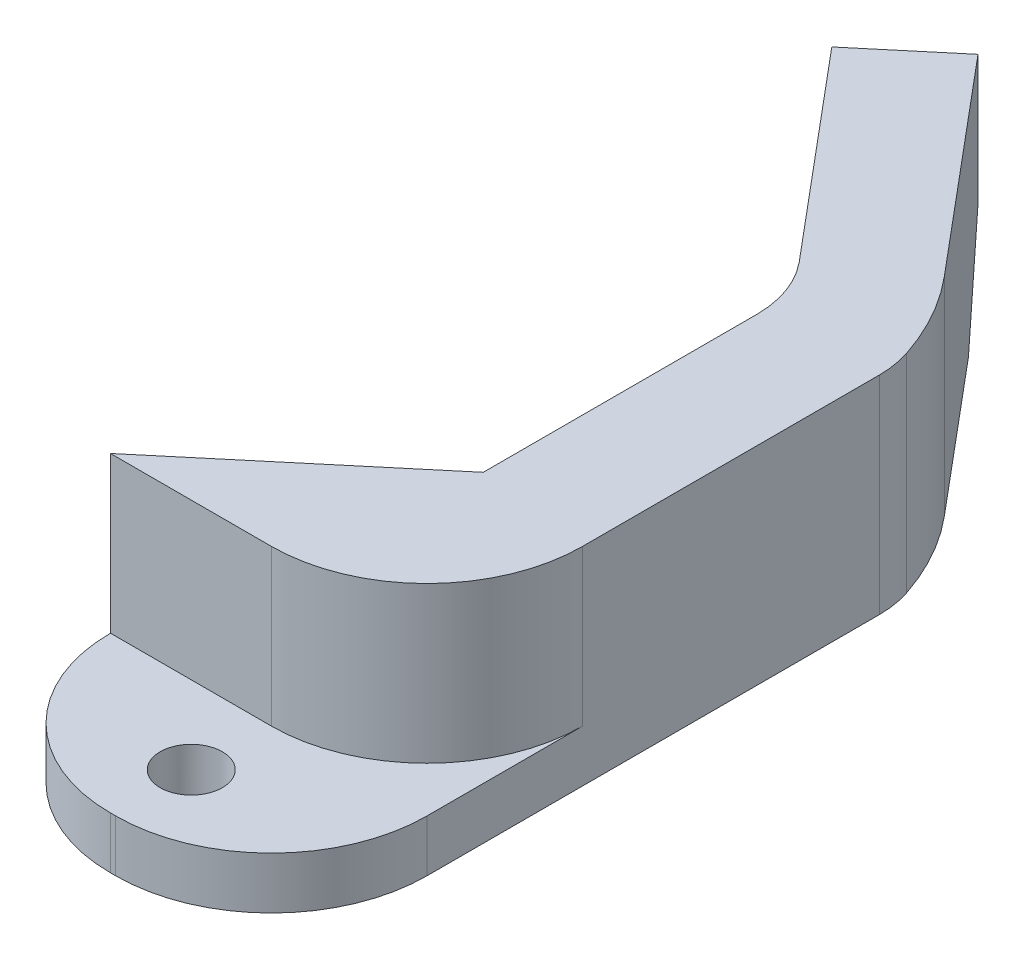
ISO-10303-21;
HEADER;
FILE_DESCRIPTION(('STEP AP214'),'2;1');
FILE_NAME('part.step','',(''),(''),'','','');
FILE_SCHEMA(('AUTOMOTIVE_DESIGN { 1 0 10303 214 1 1 1 1 }'));
ENDSEC;
DATA;
#1=APPLICATION_CONTEXT('core data for automotive mechanical design processes');
#2=APPLICATION_PROTOCOL_DEFINITION('international standard','automotive_design',2000,#1);
#3=PRODUCT_CONTEXT('',#1,'mechanical');
#4=PRODUCT('Part','Part','',(#3));
#5=PRODUCT_RELATED_PRODUCT_CATEGORY('part','',(#4));
#6=PRODUCT_DEFINITION_FORMATION('','',#4);
#7=PRODUCT_DEFINITION_CONTEXT('part definition',#1,'design');
#8=PRODUCT_DEFINITION('design','',#6,#7);
#9=PRODUCT_DEFINITION_SHAPE('','',#8);
#10=(LENGTH_UNIT() NAMED_UNIT(*) SI_UNIT(.MILLI.,.METRE.));
#11=(NAMED_UNIT(*) PLANE_ANGLE_UNIT() SI_UNIT($,.RADIAN.));
#12=(NAMED_UNIT(*) SI_UNIT($,.STERADIAN.) SOLID_ANGLE_UNIT());
#13=UNCERTAINTY_MEASURE_WITH_UNIT(LENGTH_MEASURE(1.E-05),#10,'distance_accuracy_value','');
#14=(GEOMETRIC_REPRESENTATION_CONTEXT(3) GLOBAL_UNCERTAINTY_ASSIGNED_CONTEXT((#13)) GLOBAL_UNIT_ASSIGNED_CONTEXT((#10,
#11,#12)) REPRESENTATION_CONTEXT('',''));
#15=CARTESIAN_POINT('',(0.,0.,0.));
#16=DIRECTION('',(0.,0.,1.));
#17=DIRECTION('',(1.,0.,0.));
#18=AXIS2_PLACEMENT_3D('',#15,#16,#17);
#19=CARTESIAN_POINT('',(0.,20.,0.));
#20=DIRECTION('',(0.,0.,-1.));
#21=DIRECTION('',(-1.,0.,0.));
#22=AXIS2_PLACEMENT_3D('',#19,#20,#21);
#23=PLANE('',#22);
#24=DIRECTION('',(1.,0.,0.));
#25=VECTOR('',#24,1.);
#26=CARTESIAN_POINT('',(-5.50000000000001,5.,0.));
#27=LINE('',#26,#25);
#28=CARTESIAN_POINT('',(15.,5.,0.));
#29=VERTEX_POINT('',#28);
#30=CARTESIAN_POINT('',(15.5,5.,0.));
#31=VERTEX_POINT('',#30);
#32=EDGE_CURVE('E286',#29,#31,#27,.T.);
#33=ORIENTED_EDGE('',*,*,#32,.F.);
#34=DIRECTION('',(0.,-1.,0.));
#35=VECTOR('',#34,1.);
#36=CARTESIAN_POINT('',(15.,20.,0.));
#37=LINE('',#36,#35);
#38=CARTESIAN_POINT('',(15.,0.,0.));
#39=VERTEX_POINT('',#38);
#40=EDGE_CURVE('E189',#29,#39,#37,.T.);
#41=ORIENTED_EDGE('',*,*,#40,.T.);
#42=DIRECTION('',(1.,0.,0.));
#43=VECTOR('',#42,1.);
#44=CARTESIAN_POINT('',(0.,0.,0.));
#45=LINE('',#44,#43);
#46=CARTESIAN_POINT('',(15.5,0.,0.));
#47=VERTEX_POINT('',#46);
#48=EDGE_CURVE('E251',#39,#47,#45,.T.);
#49=ORIENTED_EDGE('',*,*,#48,.T.);
#50=DIRECTION('',(0.,-1.,0.));
#51=VECTOR('',#50,1.);
#52=CARTESIAN_POINT('',(15.5,20.,0.));
#53=LINE('',#52,#51);
#54=EDGE_CURVE('E178',#47,#31,#53,.F.);
#55=ORIENTED_EDGE('',*,*,#54,.T.);
#56=EDGE_LOOP('',(#33,#41,#49,#55));
#57=FACE_BOUND('',#56,.T.);
#58=ADVANCED_FACE('F41',(#57),#23,.F.);
#59=CARTESIAN_POINT('',(30.5,20.,0.));
#60=DIRECTION('',(-1.,0.,0.));
#61=DIRECTION('',(0.,0.,1.));
#62=AXIS2_PLACEMENT_3D('',#59,#60,#61);
#63=PLANE('',#62);
#64=DIRECTION('',(0.,0.,-1.));
#65=VECTOR('',#64,1.);
#66=CARTESIAN_POINT('',(30.5,0.,0.));
#67=LINE('',#66,#65);
#68=CARTESIAN_POINT('',(30.5,0.,-15.));
#69=VERTEX_POINT('',#68);
#70=CARTESIAN_POINT('',(30.5,0.,-58.5939951371004));
#71=VERTEX_POINT('',#70);
#72=EDGE_CURVE('E246',#69,#71,#67,.T.);
#73=ORIENTED_EDGE('',*,*,#72,.T.);
#74=DIRECTION('',(0.,1.,0.));
#75=VECTOR('',#74,1.);
#76=CARTESIAN_POINT('',(30.5,20.,-58.5939951371004));
#77=LINE('',#76,#75);
#78=CARTESIAN_POINT('',(30.5,20.,-58.5939951371004));
#79=VERTEX_POINT('',#78);
#80=EDGE_CURVE('E49',#71,#79,#77,.T.);
#81=ORIENTED_EDGE('',*,*,#80,.T.);
#82=DIRECTION('',(0.,0.,-1.));
#83=VECTOR('',#82,1.);
#84=CARTESIAN_POINT('',(30.5,20.,0.));
#85=LINE('',#84,#83);
#86=CARTESIAN_POINT('',(30.5,20.,-30.));
#87=VERTEX_POINT('',#86);
#88=EDGE_CURVE('E259',#87,#79,#85,.T.);
#89=ORIENTED_EDGE('',*,*,#88,.F.);
#90=DIRECTION('',(0.,1.,0.));
#91=VECTOR('',#90,1.);
#92=CARTESIAN_POINT('',(30.5,20.,-30.));
#93=LINE('',#92,#91);
#94=CARTESIAN_POINT('',(30.5,5.,-30.));
#95=VERTEX_POINT('',#94);
#96=EDGE_CURVE('E211',#87,#95,#93,.F.);
#97=ORIENTED_EDGE('',*,*,#96,.T.);
#98=DIRECTION('',(0.,0.,1.));
#99=VECTOR('',#98,1.);
#100=CARTESIAN_POINT('',(30.5,5.,0.));
#101=LINE('',#100,#99);
#102=CARTESIAN_POINT('',(30.5,5.,-15.));
#103=VERTEX_POINT('',#102);
#104=EDGE_CURVE('E209',#95,#103,#101,.T.);
#105=ORIENTED_EDGE('',*,*,#104,.T.);
#106=DIRECTION('',(0.,-1.,0.));
#107=VECTOR('',#106,1.);
#108=CARTESIAN_POINT('',(30.5,20.,-15.));
#109=LINE('',#108,#107);
#110=EDGE_CURVE('E201',#103,#69,#109,.T.);
#111=ORIENTED_EDGE('',*,*,#110,.T.);
#112=EDGE_LOOP('',(#73,#81,#89,#97,#105,#111));
#113=FACE_BOUND('',#112,.T.);
#114=ADVANCED_FACE('F317',(#113),#63,.F.);
#115=CARTESIAN_POINT('',(8.48945828884561,20.,-90.1108534386344));
#116=DIRECTION('',(-0.766044443118981,0.,0.642787609686535));
#117=DIRECTION('',(0.642787609686535,0.,0.766044443118981));
#118=AXIS2_PLACEMENT_3D('',#115,#116,#117);
#119=PLANE('',#118);
#120=DIRECTION('',(-0.642787609686535,0.,-0.766044443118981));
#121=VECTOR('',#120,1.);
#122=CARTESIAN_POINT('',(8.48945828884561,20.,-90.1108534386344));
#123=LINE('',#122,#121);
#124=CARTESIAN_POINT('',(25.4139635209396,20.,-69.9410135254067));
#125=VERTEX_POINT('',#124);
#126=CARTESIAN_POINT('',(8.48945828884561,20.,-90.1108534386344));
#127=VERTEX_POINT('',#126);
#128=EDGE_CURVE('E297',#125,#127,#123,.T.);
#129=ORIENTED_EDGE('',*,*,#128,.F.);
#130=DIRECTION('',(0.,-1.,0.));
#131=VECTOR('',#130,1.);
#132=CARTESIAN_POINT('',(25.4139635209396,20.,-69.9410135254067));
#133=LINE('',#132,#131);
#134=CARTESIAN_POINT('',(25.4139635209396,0.,-69.9410135254067));
#135=VERTEX_POINT('',#134);
#136=EDGE_CURVE('E227',#125,#135,#133,.T.);
#137=ORIENTED_EDGE('',*,*,#136,.T.);
#138=DIRECTION('',(-0.642787609686535,0.,-0.766044443118981));
#139=VECTOR('',#138,1.);
#140=CARTESIAN_POINT('',(8.48945828884561,0.,-90.1108534386344));
#141=LINE('',#140,#139);
#142=CARTESIAN_POINT('',(13.3103653614946,0.,-84.3655201152421));
#143=VERTEX_POINT('',#142);
#144=EDGE_CURVE('E171',#135,#143,#141,.T.);
#145=ORIENTED_EDGE('',*,*,#144,.T.);
#146=DIRECTION('',(0.45451947767204,-0.707106781186548,0.541675220419704));
#147=VECTOR('',#146,1.);
#148=CARTESIAN_POINT('',(13.3103653614946,0.,-84.3655201152421));
#149=LINE('',#148,#147);
#150=CARTESIAN_POINT('',(8.4894582888456,7.5,-90.1108534386345));
#151=VERTEX_POINT('',#150);
#152=EDGE_CURVE('E154',#151,#143,#149,.T.);
#153=ORIENTED_EDGE('',*,*,#152,.F.);
#154=DIRECTION('',(0.,-1.,0.));
#155=VECTOR('',#154,1.);
#156=CARTESIAN_POINT('',(8.48945828884561,20.,-90.1108534386344));
#157=LINE('',#156,#155);
#158=EDGE_CURVE('E167',#127,#151,#157,.T.);
#159=ORIENTED_EDGE('',*,*,#158,.F.);
#160=EDGE_LOOP('',(#129,#137,#145,#153,#159));
#161=FACE_BOUND('',#160,.T.);
#162=ADVANCED_FACE('F166',(#161),#119,.F.);
#163=CARTESIAN_POINT('',(0.829013857655794,20.,-83.6829773417691));
#164=DIRECTION('',(0.642787609686535,0.,0.766044443118982));
#165=DIRECTION('',(0.766044443118982,0.,-0.642787609686535));
#166=AXIS2_PLACEMENT_3D('',#163,#164,#165);
#167=PLANE('',#166);
#168=ORIENTED_EDGE('',*,*,#158,.T.);
#169=DIRECTION('',(0.766044443118981,0.,-0.642787609686535));
#170=VECTOR('',#169,1.);
#171=CARTESIAN_POINT('',(-19.0881416634377,7.5,-66.9704994899192));
#172=LINE('',#171,#170);
#173=CARTESIAN_POINT('',(0.829013857655783,7.5,-83.6829773417691));
#174=VERTEX_POINT('',#173);
#175=EDGE_CURVE('E151',#174,#151,#172,.T.);
#176=ORIENTED_EDGE('',*,*,#175,.F.);
#177=DIRECTION('',(0.,-1.,0.));
#178=VECTOR('',#177,1.);
#179=CARTESIAN_POINT('',(0.829013857655794,20.,-83.6829773417691));
#180=LINE('',#179,#178);
#181=CARTESIAN_POINT('',(0.829013857655794,20.,-83.6829773417691));
#182=VERTEX_POINT('',#181);
#183=EDGE_CURVE('E176',#182,#174,#180,.T.);
#184=ORIENTED_EDGE('',*,*,#183,.F.);
#185=DIRECTION('',(-0.766044443118982,0.,0.642787609686535));
#186=VECTOR('',#185,1.);
#187=CARTESIAN_POINT('',(0.829013857655794,20.,-83.6829773417691));
#188=LINE('',#187,#186);
#189=EDGE_CURVE('E174',#127,#182,#188,.T.);
#190=ORIENTED_EDGE('',*,*,#189,.F.);
#191=EDGE_LOOP('',(#168,#176,#184,#190));
#192=FACE_BOUND('',#191,.T.);
#193=ADVANCED_FACE('F173',(#192),#167,.F.);
#194=CARTESIAN_POINT('',(19.534133299534,20.,-61.3910840470067));
#195=DIRECTION('',(0.766044443118982,0.,-0.642787609686535));
#196=DIRECTION('',(-0.642787609686535,0.,-0.766044443118982));
#197=AXIS2_PLACEMENT_3D('',#194,#195,#196);
#198=PLANE('',#197);
#199=DIRECTION('',(0.642787609686535,0.,0.766044443118982));
#200=VECTOR('',#199,1.);
#201=CARTESIAN_POINT('',(19.534133299534,0.,-61.3910840470067));
#202=LINE('',#201,#200);
#203=CARTESIAN_POINT('',(5.64992093030479,0.,-77.9376440183767));
#204=VERTEX_POINT('',#203);
#205=CARTESIAN_POINT('',(17.1945777307238,0.,-64.1792578012101));
#206=VERTEX_POINT('',#205);
#207=EDGE_CURVE('E245',#204,#206,#202,.T.);
#208=ORIENTED_EDGE('',*,*,#207,.T.);
#209=DIRECTION('',(0.,-1.,0.));
#210=VECTOR('',#209,1.);
#211=CARTESIAN_POINT('',(17.1945777307238,20.,-64.1792578012101));
#212=LINE('',#211,#210);
#213=CARTESIAN_POINT('',(17.1945777307238,20.,-64.1792578012101));
#214=VERTEX_POINT('',#213);
#215=EDGE_CURVE('E221',#206,#214,#212,.F.);
#216=ORIENTED_EDGE('',*,*,#215,.T.);
#217=DIRECTION('',(0.642787609686535,0.,0.766044443118982));
#218=VECTOR('',#217,1.);
#219=CARTESIAN_POINT('',(19.534133299534,20.,-61.3910840470067));
#220=LINE('',#219,#218);
#221=EDGE_CURVE('E300',#182,#214,#220,.T.);
#222=ORIENTED_EDGE('',*,*,#221,.F.);
#223=ORIENTED_EDGE('',*,*,#183,.T.);
#224=DIRECTION('',(0.454519477672041,-0.707106781186548,0.541675220419704));
#225=VECTOR('',#224,1.);
#226=CARTESIAN_POINT('',(6.16415101805403,-0.800000000000006,-77.3248084638815));
#227=LINE('',#226,#225);
#228=EDGE_CURVE('E157',#174,#204,#227,.T.);
#229=ORIENTED_EDGE('',*,*,#228,.T.);
#230=EDGE_LOOP('',(#208,#216,#222,#223,#229));
#231=FACE_BOUND('',#230,.T.);
#232=ADVANCED_FACE('F324',(#231),#198,.F.);
#233=CARTESIAN_POINT('',(19.534133299534,20.,-61.3910840470067));
#234=DIRECTION('',(1.,0.,0.));
#235=DIRECTION('',(0.,0.,-1.));
#236=AXIS2_PLACEMENT_3D('',#233,#234,#235);
#237=PLANE('',#236);
#238=DIRECTION('',(0.,0.,1.));
#239=VECTOR('',#238,1.);
#240=CARTESIAN_POINT('',(19.534133299534,20.,-61.3910840470067));
#241=LINE('',#240,#239);
#242=CARTESIAN_POINT('',(19.534133299534,20.,-57.7513817043447));
#243=VERTEX_POINT('',#242);
#244=CARTESIAN_POINT('',(19.534133299534,20.,-31.3910840470067));
#245=VERTEX_POINT('',#244);
#246=EDGE_CURVE('E303',#243,#245,#241,.T.);
#247=ORIENTED_EDGE('',*,*,#246,.F.);
#248=DIRECTION('',(0.,-1.,0.));
#249=VECTOR('',#248,1.);
#250=CARTESIAN_POINT('',(19.534133299534,0.,-57.7513817043447));
#251=LINE('',#250,#249);
#252=CARTESIAN_POINT('',(19.534133299534,0.,-57.7513817043447));
#253=VERTEX_POINT('',#252);
#254=EDGE_CURVE('E218',#243,#253,#251,.T.);
#255=ORIENTED_EDGE('',*,*,#254,.T.);
#256=DIRECTION('',(0.,0.,1.));
#257=VECTOR('',#256,1.);
#258=CARTESIAN_POINT('',(19.534133299534,0.,-61.3910840470067));
#259=LINE('',#258,#257);
#260=CARTESIAN_POINT('',(19.534133299534,0.,-31.3910840470067));
#261=VERTEX_POINT('',#260);
#262=EDGE_CURVE('E249',#253,#261,#259,.T.);
#263=ORIENTED_EDGE('',*,*,#262,.T.);
#264=DIRECTION('',(0.,-1.,0.));
#265=VECTOR('',#264,1.);
#266=CARTESIAN_POINT('',(19.534133299534,20.,-31.3910840470067));
#267=LINE('',#266,#265);
#268=EDGE_CURVE('E180',#245,#261,#267,.T.);
#269=ORIENTED_EDGE('',*,*,#268,.F.);
#270=EDGE_LOOP('',(#247,#255,#263,#269));
#271=FACE_BOUND('',#270,.T.);
#272=ADVANCED_FACE('F329',(#271),#237,.F.);
#273=CARTESIAN_POINT('',(19.534133299534,20.,-31.3910840470067));
#274=DIRECTION('',(0.642787609686538,0.,0.766044443118979));
#275=DIRECTION('',(0.766044443118979,0.,-0.642787609686538));
#276=AXIS2_PLACEMENT_3D('',#273,#274,#275);
#277=PLANE('',#276);
#278=DIRECTION('',(-0.766044443118979,0.,0.642787609686538));
#279=VECTOR('',#278,1.);
#280=CARTESIAN_POINT('',(19.534133299534,0.,-31.3910840470067));
#281=LINE('',#280,#279);
#282=CARTESIAN_POINT('',(0.,0.,-15.));
#283=VERTEX_POINT('',#282);
#284=EDGE_CURVE('E256',#261,#283,#281,.T.);
#285=ORIENTED_EDGE('',*,*,#284,.T.);
#286=DIRECTION('',(0.,-1.,0.));
#287=VECTOR('',#286,1.);
#288=CARTESIAN_POINT('',(0.,20.,-15.));
#289=LINE('',#288,#287);
#290=CARTESIAN_POINT('',(0.,5.,-15.));
#291=VERTEX_POINT('',#290);
#292=EDGE_CURVE('E261',#291,#283,#289,.T.);
#293=ORIENTED_EDGE('',*,*,#292,.F.);
#294=CARTESIAN_POINT('',(0.,20.,-15.));
#295=VERTEX_POINT('',#294);
#296=EDGE_CURVE('E260',#295,#291,#289,.T.);
#297=ORIENTED_EDGE('',*,*,#296,.F.);
#298=DIRECTION('',(-0.766044443118979,0.,0.642787609686538));
#299=VECTOR('',#298,1.);
#300=CARTESIAN_POINT('',(19.534133299534,20.,-31.3910840470067));
#301=LINE('',#300,#299);
#302=EDGE_CURVE('E272',#245,#295,#301,.T.);
#303=ORIENTED_EDGE('',*,*,#302,.F.);
#304=ORIENTED_EDGE('',*,*,#268,.T.);
#305=EDGE_LOOP('',(#285,#293,#297,#303,#304));
#306=FACE_BOUND('',#305,.T.);
#307=ADVANCED_FACE('F267',(#306),#277,.F.);
#308=CARTESIAN_POINT('',(0.,20.,0.));
#309=DIRECTION('',(0.,1.,0.));
#310=DIRECTION('',(0.,0.,1.));
#311=AXIS2_PLACEMENT_3D('',#308,#309,#310);
#312=PLANE('',#311);
#313=ORIENTED_EDGE('',*,*,#88,.T.);
#314=CARTESIAN_POINT('',(20.5,20.,-58.5939951371004));
#315=DIRECTION('',(0.,1.,0.));
#316=DIRECTION('',(0.,0.,1.));
#317=AXIS2_PLACEMENT_3D('',#314,#315,#316);
#318=CIRCLE('',#317,10.);
#319=CARTESIAN_POINT('',(29.99143170469,20.,-61.7424430396718));
#320=VERTEX_POINT('',#319);
#321=EDGE_CURVE('E11',#79,#320,#318,.T.);
#322=ORIENTED_EDGE('',*,*,#321,.T.);
#323=CARTESIAN_POINT('',(6.26285244296506,20.,-53.8713232832433));
#324=DIRECTION('',(0.,1.,0.));
#325=DIRECTION('',(0.,0.,1.));
#326=AXIS2_PLACEMENT_3D('',#323,#324,#325);
#327=CIRCLE('',#326,25.);
#328=EDGE_CURVE('E231',#320,#125,#327,.T.);
#329=ORIENTED_EDGE('',*,*,#328,.T.);
#330=ORIENTED_EDGE('',*,*,#128,.T.);
#331=ORIENTED_EDGE('',*,*,#189,.T.);
#332=ORIENTED_EDGE('',*,*,#221,.T.);
#333=CARTESIAN_POINT('',(9.53413329953397,20.,-57.7513817043447));
#334=DIRECTION('',(0.,1.,0.));
#335=DIRECTION('',(0.,0.,1.));
#336=AXIS2_PLACEMENT_3D('',#333,#334,#335);
#337=CIRCLE('',#336,10.);
#338=EDGE_CURVE('E225',#214,#243,#337,.F.);
#339=ORIENTED_EDGE('',*,*,#338,.T.);
#340=ORIENTED_EDGE('',*,*,#246,.T.);
#341=ORIENTED_EDGE('',*,*,#302,.T.);
#342=DIRECTION('',(-1.,0.,0.));
#343=VECTOR('',#342,1.);
#344=CARTESIAN_POINT('',(0.,20.,-15.));
#345=LINE('',#344,#343);
#346=CARTESIAN_POINT('',(15.5,20.,-15.));
#347=VERTEX_POINT('',#346);
#348=EDGE_CURVE('E175',#347,#295,#345,.T.);
#349=ORIENTED_EDGE('',*,*,#348,.F.);
#350=CARTESIAN_POINT('',(15.5,20.,-30.));
#351=DIRECTION('',(0.,1.,0.));
#352=DIRECTION('',(0.,0.,1.));
#353=AXIS2_PLACEMENT_3D('',#350,#351,#352);
#354=CIRCLE('',#353,15.);
#355=EDGE_CURVE('E207',#347,#87,#354,.T.);
#356=ORIENTED_EDGE('',*,*,#355,.T.);
#357=EDGE_LOOP('',(#313,#322,#329,#330,#331,#332,#339,#340,#341,#349,#356));
#358=FACE_BOUND('',#357,.T.);
#359=ADVANCED_FACE('F307',(#358),#312,.T.);
#360=CARTESIAN_POINT('',(0.,0.,0.));
#361=DIRECTION('',(0.,1.,0.));
#362=DIRECTION('',(0.,0.,1.));
#363=AXIS2_PLACEMENT_3D('',#360,#361,#362);
#364=PLANE('',#363);
#365=CARTESIAN_POINT('',(15.2845330487261,0.,-7.5));
#366=DIRECTION('',(0.,1.,0.));
#367=DIRECTION('',(0.,0.,1.));
#368=AXIS2_PLACEMENT_3D('',#365,#366,#367);
#369=CIRCLE('',#368,3.);
#370=CARTESIAN_POINT('',(15.2845330487261,0.,-4.5));
#371=VERTEX_POINT('',#370);
#372=EDGE_CURVE('E187',#371,#371,#369,.T.);
#373=ORIENTED_EDGE('',*,*,#372,.T.);
#374=EDGE_LOOP('',(#373));
#375=FACE_BOUND('',#374,.T.);
#376=CARTESIAN_POINT('',(6.26285244296506,0.,-53.8713232832433));
#377=DIRECTION('',(0.,1.,0.));
#378=DIRECTION('',(0.,0.,1.));
#379=AXIS2_PLACEMENT_3D('',#376,#377,#378);
#380=CIRCLE('',#379,25.);
#381=CARTESIAN_POINT('',(29.99143170469,0.,-61.7424430396718));
#382=VERTEX_POINT('',#381);
#383=EDGE_CURVE('E229',#135,#382,#380,.F.);
#384=ORIENTED_EDGE('',*,*,#383,.T.);
#385=CARTESIAN_POINT('',(20.5,0.,-58.5939951371004));
#386=DIRECTION('',(0.,1.,0.));
#387=DIRECTION('',(0.,0.,1.));
#388=AXIS2_PLACEMENT_3D('',#385,#386,#387);
#389=CIRCLE('',#388,10.);
#390=EDGE_CURVE('E63',#382,#71,#389,.F.);
#391=ORIENTED_EDGE('',*,*,#390,.T.);
#392=ORIENTED_EDGE('',*,*,#72,.F.);
#393=CARTESIAN_POINT('',(15.5,0.,-15.));
#394=DIRECTION('',(0.,1.,0.));
#395=DIRECTION('',(0.,0.,1.));
#396=AXIS2_PLACEMENT_3D('',#393,#394,#395);
#397=CIRCLE('',#396,15.);
#398=EDGE_CURVE('E192',#69,#47,#397,.F.);
#399=ORIENTED_EDGE('',*,*,#398,.T.);
#400=ORIENTED_EDGE('',*,*,#48,.F.);
#401=CARTESIAN_POINT('',(15.,0.,-15.));
#402=DIRECTION('',(0.,1.,0.));
#403=DIRECTION('',(0.,0.,1.));
#404=AXIS2_PLACEMENT_3D('',#401,#402,#403);
#405=CIRCLE('',#404,15.);
#406=EDGE_CURVE('E194',#39,#283,#405,.F.);
#407=ORIENTED_EDGE('',*,*,#406,.T.);
#408=ORIENTED_EDGE('',*,*,#284,.F.);
#409=ORIENTED_EDGE('',*,*,#262,.F.);
#410=CARTESIAN_POINT('',(9.53413329953397,0.,-57.7513817043447));
#411=DIRECTION('',(0.,1.,0.));
#412=DIRECTION('',(0.,0.,1.));
#413=AXIS2_PLACEMENT_3D('',#410,#411,#412);
#414=CIRCLE('',#413,10.);
#415=EDGE_CURVE('E223',#253,#206,#414,.T.);
#416=ORIENTED_EDGE('',*,*,#415,.T.);
#417=ORIENTED_EDGE('',*,*,#207,.F.);
#418=DIRECTION('',(0.766044443118981,0.,-0.642787609686535));
#419=VECTOR('',#418,1.);
#420=CARTESIAN_POINT('',(-36.0423868120039,0.,-42.9536439688763));
#421=LINE('',#420,#419);
#422=EDGE_CURVE('E216',#204,#143,#421,.T.);
#423=ORIENTED_EDGE('',*,*,#422,.T.);
#424=ORIENTED_EDGE('',*,*,#144,.F.);
#425=EDGE_LOOP('',(#384,#391,#392,#399,#400,#407,#408,#409,#416,#417,#423,#424));
#426=FACE_BOUND('',#425,.T.);
#427=ADVANCED_FACE('F243',(#375,#426),#364,.F.);
#428=CARTESIAN_POINT('',(-5.50000000000001,5.,-15.));
#429=DIRECTION('',(0.,-1.,0.));
#430=DIRECTION('',(0.,0.,-1.));
#431=AXIS2_PLACEMENT_3D('',#428,#429,#430);
#432=PLANE('',#431);
#433=CARTESIAN_POINT('',(15.2845330487261,5.,-7.5));
#434=DIRECTION('',(0.,-1.,0.));
#435=DIRECTION('',(0.,0.,-1.));
#436=AXIS2_PLACEMENT_3D('',#433,#434,#435);
#437=CIRCLE('',#436,3.);
#438=CARTESIAN_POINT('',(15.2845330487261,5.,-10.5));
#439=VERTEX_POINT('',#438);
#440=EDGE_CURVE('E184',#439,#439,#437,.T.);
#441=ORIENTED_EDGE('',*,*,#440,.T.);
#442=EDGE_LOOP('',(#441));
#443=FACE_BOUND('',#442,.T.);
#444=DIRECTION('',(1.,0.,0.));
#445=VECTOR('',#444,1.);
#446=CARTESIAN_POINT('',(-5.50000000000001,5.,-15.));
#447=LINE('',#446,#445);
#448=CARTESIAN_POINT('',(15.5,5.,-15.));
#449=VERTEX_POINT('',#448);
#450=EDGE_CURVE('E289',#291,#449,#447,.T.);
#451=ORIENTED_EDGE('',*,*,#450,.F.);
#452=CARTESIAN_POINT('',(15.,5.,-15.));
#453=DIRECTION('',(0.,-1.,0.));
#454=DIRECTION('',(0.,0.,-1.));
#455=AXIS2_PLACEMENT_3D('',#452,#453,#454);
#456=CIRCLE('',#455,15.);
#457=EDGE_CURVE('E199',#291,#29,#456,.F.);
#458=ORIENTED_EDGE('',*,*,#457,.T.);
#459=ORIENTED_EDGE('',*,*,#32,.T.);
#460=CARTESIAN_POINT('',(15.5,5.,-15.));
#461=DIRECTION('',(0.,-1.,0.));
#462=DIRECTION('',(0.,0.,-1.));
#463=AXIS2_PLACEMENT_3D('',#460,#461,#462);
#464=CIRCLE('',#463,15.);
#465=EDGE_CURVE('E196',#31,#103,#464,.F.);
#466=ORIENTED_EDGE('',*,*,#465,.T.);
#467=ORIENTED_EDGE('',*,*,#104,.F.);
#468=CARTESIAN_POINT('',(15.5,5.,-30.));
#469=DIRECTION('',(0.,-1.,0.));
#470=DIRECTION('',(0.,0.,-1.));
#471=AXIS2_PLACEMENT_3D('',#468,#469,#470);
#472=CIRCLE('',#471,15.);
#473=EDGE_CURVE('E214',#95,#449,#472,.T.);
#474=ORIENTED_EDGE('',*,*,#473,.T.);
#475=EDGE_LOOP('',(#451,#458,#459,#466,#467,#474));
#476=FACE_BOUND('',#475,.T.);
#477=ADVANCED_FACE('F312',(#443,#476),#432,.F.);
#478=CARTESIAN_POINT('',(-5.50000000000001,20.,-15.));
#479=DIRECTION('',(0.,0.,-1.));
#480=DIRECTION('',(-1.,0.,0.));
#481=AXIS2_PLACEMENT_3D('',#478,#479,#480);
#482=PLANE('',#481);
#483=ORIENTED_EDGE('',*,*,#450,.T.);
#484=DIRECTION('',(0.,1.,0.));
#485=VECTOR('',#484,1.);
#486=CARTESIAN_POINT('',(15.5,20.,-15.));
#487=LINE('',#486,#485);
#488=EDGE_CURVE('E204',#449,#347,#487,.T.);
#489=ORIENTED_EDGE('',*,*,#488,.T.);
#490=ORIENTED_EDGE('',*,*,#348,.T.);
#491=ORIENTED_EDGE('',*,*,#296,.T.);
#492=EDGE_LOOP('',(#483,#489,#490,#491));
#493=FACE_BOUND('',#492,.T.);
#494=ADVANCED_FACE('F310',(#493),#482,.F.);
#495=CARTESIAN_POINT('',(15.2845330487261,-16.,-7.5));
#496=DIRECTION('',(0.,1.,0.));
#497=DIRECTION('',(0.,0.,1.));
#498=AXIS2_PLACEMENT_3D('',#495,#496,#497);
#499=CYLINDRICAL_SURFACE('',#498,3.);
#500=ORIENTED_EDGE('',*,*,#440,.F.);
#501=EDGE_LOOP('',(#500));
#502=FACE_BOUND('',#501,.T.);
#503=ORIENTED_EDGE('',*,*,#372,.F.);
#504=EDGE_LOOP('',(#503));
#505=FACE_BOUND('',#504,.T.);
#506=ADVANCED_FACE('F348',(#502,#505),#499,.F.);
#507=CARTESIAN_POINT('',(15.,20.,-15.));
#508=DIRECTION('',(0.,-1.,0.));
#509=DIRECTION('',(0.,0.,-1.));
#510=AXIS2_PLACEMENT_3D('',#507,#508,#509);
#511=CYLINDRICAL_SURFACE('',#510,15.);
#512=ORIENTED_EDGE('',*,*,#457,.F.);
#513=ORIENTED_EDGE('',*,*,#292,.T.);
#514=ORIENTED_EDGE('',*,*,#406,.F.);
#515=ORIENTED_EDGE('',*,*,#40,.F.);
#516=EDGE_LOOP('',(#512,#513,#514,#515));
#517=FACE_BOUND('',#516,.T.);
#518=ADVANCED_FACE('F281',(#517),#511,.T.);
#519=CARTESIAN_POINT('',(15.5,20.,-15.));
#520=DIRECTION('',(0.,-1.,0.));
#521=DIRECTION('',(0.,0.,-1.));
#522=AXIS2_PLACEMENT_3D('',#519,#520,#521);
#523=CYLINDRICAL_SURFACE('',#522,15.);
#524=ORIENTED_EDGE('',*,*,#465,.F.);
#525=ORIENTED_EDGE('',*,*,#54,.F.);
#526=ORIENTED_EDGE('',*,*,#398,.F.);
#527=ORIENTED_EDGE('',*,*,#110,.F.);
#528=EDGE_LOOP('',(#524,#525,#526,#527));
#529=FACE_BOUND('',#528,.T.);
#530=ADVANCED_FACE('F320',(#529),#523,.T.);
#531=CARTESIAN_POINT('',(15.5,20.,-30.));
#532=DIRECTION('',(0.,1.,0.));
#533=DIRECTION('',(0.,0.,1.));
#534=AXIS2_PLACEMENT_3D('',#531,#532,#533);
#535=CYLINDRICAL_SURFACE('',#534,15.);
#536=ORIENTED_EDGE('',*,*,#473,.F.);
#537=ORIENTED_EDGE('',*,*,#96,.F.);
#538=ORIENTED_EDGE('',*,*,#355,.F.);
#539=ORIENTED_EDGE('',*,*,#488,.F.);
#540=EDGE_LOOP('',(#536,#537,#538,#539));
#541=FACE_BOUND('',#540,.T.);
#542=ADVANCED_FACE('F316',(#541),#535,.T.);
#543=CARTESIAN_POINT('',(-14.2672345907887,0.,-61.2251661665268));
#544=DIRECTION('',(0.454519477672041,0.707106781186547,0.541675220419704));
#545=DIRECTION('',(0.,-0.608120402411345,0.793844806099444));
#546=AXIS2_PLACEMENT_3D('',#543,#544,#545);
#547=PLANE('',#546);
#548=ORIENTED_EDGE('',*,*,#175,.T.);
#549=ORIENTED_EDGE('',*,*,#152,.T.);
#550=ORIENTED_EDGE('',*,*,#422,.F.);
#551=ORIENTED_EDGE('',*,*,#228,.F.);
#552=EDGE_LOOP('',(#548,#549,#550,#551));
#553=FACE_BOUND('',#552,.T.);
#554=ADVANCED_FACE('F153',(#553),#547,.F.);
#555=CARTESIAN_POINT('',(9.53413329953397,20.,-57.7513817043447));
#556=DIRECTION('',(0.,1.,0.));
#557=DIRECTION('',(0.,0.,1.));
#558=AXIS2_PLACEMENT_3D('',#555,#556,#557);
#559=CYLINDRICAL_SURFACE('',#558,10.);
#560=ORIENTED_EDGE('',*,*,#338,.F.);
#561=ORIENTED_EDGE('',*,*,#215,.F.);
#562=ORIENTED_EDGE('',*,*,#415,.F.);
#563=ORIENTED_EDGE('',*,*,#254,.F.);
#564=EDGE_LOOP('',(#560,#561,#562,#563));
#565=FACE_BOUND('',#564,.T.);
#566=ADVANCED_FACE('F327',(#565),#559,.F.);
#567=CARTESIAN_POINT('',(6.26285244296506,20.,-53.8713232832433));
#568=DIRECTION('',(0.,-1.,0.));
#569=DIRECTION('',(0.,0.,-1.));
#570=AXIS2_PLACEMENT_3D('',#567,#568,#569);
#571=CYLINDRICAL_SURFACE('',#570,25.);
#572=ORIENTED_EDGE('',*,*,#328,.F.);
#573=DIRECTION('',(0.,-1.,0.));
#574=VECTOR('',#573,1.);
#575=CARTESIAN_POINT('',(29.99143170469,20.,-61.7424430396718));
#576=LINE('',#575,#574);
#577=EDGE_CURVE('E233',#320,#382,#576,.T.);
#578=ORIENTED_EDGE('',*,*,#577,.T.);
#579=ORIENTED_EDGE('',*,*,#383,.F.);
#580=ORIENTED_EDGE('',*,*,#136,.F.);
#581=EDGE_LOOP('',(#572,#578,#579,#580));
#582=FACE_BOUND('',#581,.T.);
#583=ADVANCED_FACE('F239',(#582),#571,.T.);
#584=CARTESIAN_POINT('',(20.5,20.,-58.5939951371004));
#585=DIRECTION('',(0.,-1.,0.));
#586=DIRECTION('',(0.,0.,-1.));
#587=AXIS2_PLACEMENT_3D('',#584,#585,#586);
#588=CYLINDRICAL_SURFACE('',#587,10.);
#589=ORIENTED_EDGE('',*,*,#321,.F.);
#590=ORIENTED_EDGE('',*,*,#80,.F.);
#591=ORIENTED_EDGE('',*,*,#390,.F.);
#592=ORIENTED_EDGE('',*,*,#577,.F.);
#593=EDGE_LOOP('',(#589,#590,#591,#592));
#594=FACE_BOUND('',#593,.T.);
#595=ADVANCED_FACE('F43',(#594),#588,.T.);
#596=CLOSED_SHELL('',(#58,#114,#162,#193,#232,#272,#307,#359,#427,#477,#494,#506,#518,#530,#542,
#554,#566,#583,#595));
#597=MANIFOLD_SOLID_BREP('B2',#596);
#598=ADVANCED_BREP_SHAPE_REPRESENTATION('',(#18,#597),#14);
#599=SHAPE_DEFINITION_REPRESENTATION(#9,#598);
ENDSEC;
END-ISO-10303-21;
